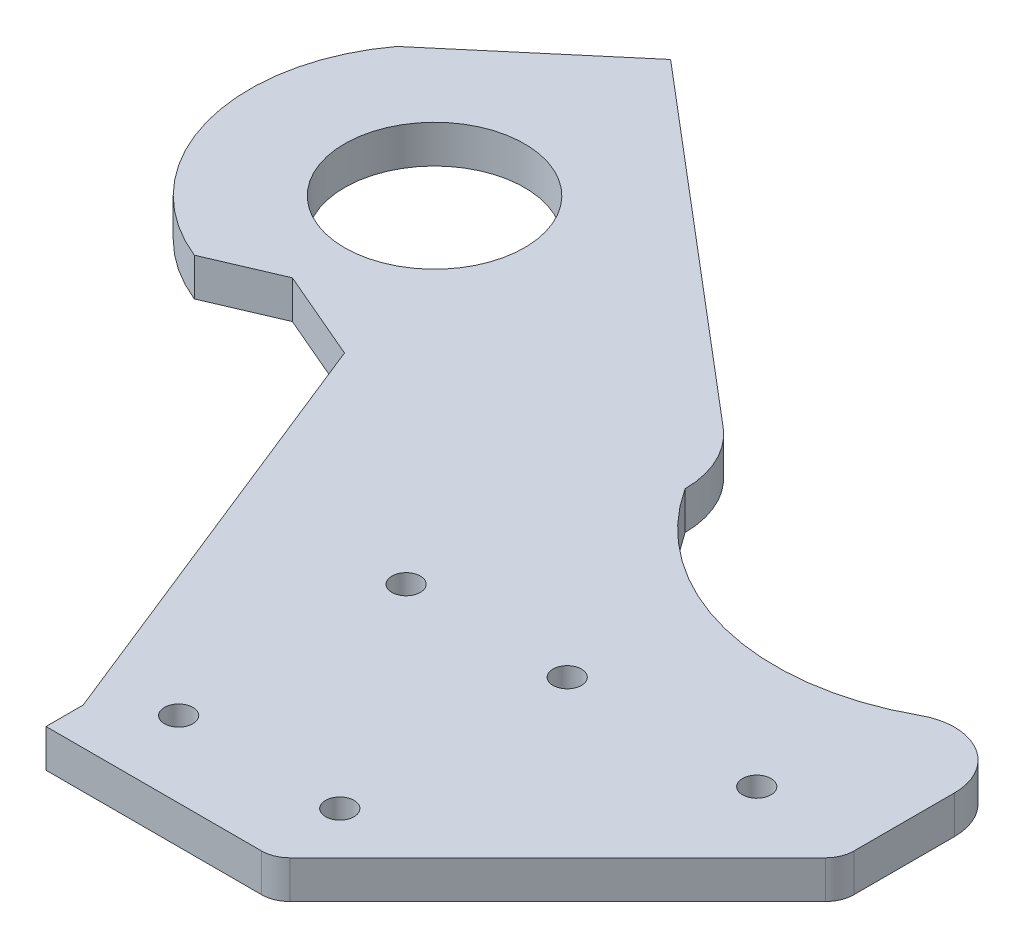
ISO-10303-21;
HEADER;
FILE_DESCRIPTION(('STEP AP214'),'2;1');
FILE_NAME('part.step','',(''),(''),'','','');
FILE_SCHEMA(('AUTOMOTIVE_DESIGN { 1 0 10303 214 1 1 1 1 }'));
ENDSEC;
DATA;
#1=APPLICATION_CONTEXT('core data for automotive mechanical design processes');
#2=APPLICATION_PROTOCOL_DEFINITION('international standard','automotive_design',2000,#1);
#3=PRODUCT_CONTEXT('',#1,'mechanical');
#4=PRODUCT('Part','Part','',(#3));
#5=PRODUCT_RELATED_PRODUCT_CATEGORY('part','',(#4));
#6=PRODUCT_DEFINITION_FORMATION('','',#4);
#7=PRODUCT_DEFINITION_CONTEXT('part definition',#1,'design');
#8=PRODUCT_DEFINITION('design','',#6,#7);
#9=PRODUCT_DEFINITION_SHAPE('','',#8);
#10=(LENGTH_UNIT() NAMED_UNIT(*) SI_UNIT(.MILLI.,.METRE.));
#11=(NAMED_UNIT(*) PLANE_ANGLE_UNIT() SI_UNIT($,.RADIAN.));
#12=(NAMED_UNIT(*) SI_UNIT($,.STERADIAN.) SOLID_ANGLE_UNIT());
#13=UNCERTAINTY_MEASURE_WITH_UNIT(LENGTH_MEASURE(1.E-05),#10,'distance_accuracy_value','');
#14=(GEOMETRIC_REPRESENTATION_CONTEXT(3) GLOBAL_UNCERTAINTY_ASSIGNED_CONTEXT((#13)) GLOBAL_UNIT_ASSIGNED_CONTEXT((#10,
#11,#12)) REPRESENTATION_CONTEXT('',''));
#15=CARTESIAN_POINT('',(0.,0.,0.));
#16=DIRECTION('',(0.,0.,1.));
#17=DIRECTION('',(1.,0.,0.));
#18=AXIS2_PLACEMENT_3D('',#15,#16,#17);
#19=CARTESIAN_POINT('',(0.,4.,0.));
#20=DIRECTION('',(0.,-1.,0.));
#21=DIRECTION('',(0.,0.,-1.));
#22=AXIS2_PLACEMENT_3D('',#19,#20,#21);
#23=PLANE('',#22);
#24=CARTESIAN_POINT('',(74.,4.,-32.));
#25=DIRECTION('',(0.,1.,0.));
#26=DIRECTION('',(0.,0.,-1.));
#27=AXIS2_PLACEMENT_3D('',#24,#25,#26);
#28=CIRCLE('',#27,1.50000000000001);
#29=CARTESIAN_POINT('',(74.,4.,-33.5));
#30=VERTEX_POINT('',#29);
#31=EDGE_CURVE('E260',#30,#30,#28,.T.);
#32=ORIENTED_EDGE('',*,*,#31,.F.);
#33=EDGE_LOOP('',(#32));
#34=FACE_BOUND('',#33,.T.);
#35=CARTESIAN_POINT('',(40.,4.,-69.));
#36=DIRECTION('',(0.,1.,0.));
#37=DIRECTION('',(0.,0.,1.));
#38=AXIS2_PLACEMENT_3D('',#35,#36,#37);
#39=CIRCLE('',#38,9.50000000000001);
#40=CARTESIAN_POINT('',(40.,4.,-59.5));
#41=VERTEX_POINT('',#40);
#42=EDGE_CURVE('E251',#41,#41,#39,.T.);
#43=ORIENTED_EDGE('',*,*,#42,.F.);
#44=EDGE_LOOP('',(#43));
#45=FACE_BOUND('',#44,.T.);
#46=CARTESIAN_POINT('',(74.,4.,-8.));
#47=DIRECTION('',(0.,1.,0.));
#48=DIRECTION('',(0.,0.,-1.));
#49=AXIS2_PLACEMENT_3D('',#46,#47,#48);
#50=CIRCLE('',#49,1.50000000000001);
#51=CARTESIAN_POINT('',(74.,4.,-9.50000000000001));
#52=VERTEX_POINT('',#51);
#53=EDGE_CURVE('E238',#52,#52,#50,.T.);
#54=ORIENTED_EDGE('',*,*,#53,.F.);
#55=EDGE_LOOP('',(#54));
#56=FACE_BOUND('',#55,.T.);
#57=CARTESIAN_POINT('',(91.,4.,-32.));
#58=DIRECTION('',(0.,1.,0.));
#59=DIRECTION('',(0.,0.,1.));
#60=AXIS2_PLACEMENT_3D('',#57,#58,#59);
#61=CIRCLE('',#60,1.5);
#62=CARTESIAN_POINT('',(91.,4.,-30.5));
#63=VERTEX_POINT('',#62);
#64=EDGE_CURVE('E281',#63,#63,#61,.T.);
#65=ORIENTED_EDGE('',*,*,#64,.F.);
#66=EDGE_LOOP('',(#65));
#67=FACE_BOUND('',#66,.T.);
#68=CARTESIAN_POINT('',(91.,4.,-8.));
#69=DIRECTION('',(0.,1.,0.));
#70=DIRECTION('',(0.,0.,1.));
#71=AXIS2_PLACEMENT_3D('',#68,#69,#70);
#72=CIRCLE('',#71,1.5);
#73=CARTESIAN_POINT('',(91.,4.,-6.5));
#74=VERTEX_POINT('',#73);
#75=EDGE_CURVE('E293',#74,#74,#72,.T.);
#76=ORIENTED_EDGE('',*,*,#75,.F.);
#77=EDGE_LOOP('',(#76));
#78=FACE_BOUND('',#77,.T.);
#79=CARTESIAN_POINT('',(111.,4.,-32.));
#80=DIRECTION('',(0.,1.,0.));
#81=DIRECTION('',(0.,0.,1.));
#82=AXIS2_PLACEMENT_3D('',#79,#80,#81);
#83=CIRCLE('',#82,1.5);
#84=CARTESIAN_POINT('',(111.,4.,-30.5));
#85=VERTEX_POINT('',#84);
#86=EDGE_CURVE('E282',#85,#85,#83,.T.);
#87=ORIENTED_EDGE('',*,*,#86,.F.);
#88=EDGE_LOOP('',(#87));
#89=FACE_BOUND('',#88,.T.);
#90=CARTESIAN_POINT('',(101.,4.,-69.));
#91=DIRECTION('',(0.,1.,0.));
#92=DIRECTION('',(0.,0.,1.));
#93=AXIS2_PLACEMENT_3D('',#90,#91,#92);
#94=CIRCLE('',#93,25.);
#95=CARTESIAN_POINT('',(80.,4.,-55.4353400337495));
#96=VERTEX_POINT('',#95);
#97=CARTESIAN_POINT('',(113.096774193548,4.,-47.1215161834669));
#98=VERTEX_POINT('',#97);
#99=EDGE_CURVE('E160',#96,#98,#94,.T.);
#100=ORIENTED_EDGE('',*,*,#99,.F.);
#101=CARTESIAN_POINT('',(70.0002315120612,4.,-55.3672945517073));
#102=DIRECTION('',(0.,-1.,0.));
#103=DIRECTION('',(0.,0.,-1.));
#104=AXIS2_PLACEMENT_3D('',#101,#102,#103);
#105=CIRCLE('',#104,10.);
#106=CARTESIAN_POINT('',(76.4665386997027,4.,-62.9953264967805));
#107=VERTEX_POINT('',#106);
#108=EDGE_CURVE('E168',#96,#107,#105,.F.);
#109=ORIENTED_EDGE('',*,*,#108,.T.);
#110=DIRECTION('',(-0.762803194507315,0.,-0.646630718764146));
#111=VECTOR('',#110,1.);
#112=CARTESIAN_POINT('',(40.,4.,-93.9081285144222));
#113=LINE('',#112,#111);
#114=CARTESIAN_POINT('',(40.,4.,-93.9081285144222));
#115=VERTEX_POINT('',#114);
#116=EDGE_CURVE('E241',#107,#115,#113,.T.);
#117=ORIENTED_EDGE('',*,*,#116,.T.);
#118=DIRECTION('',(-0.762803194507315,0.,0.646630718764146));
#119=VECTOR('',#118,1.);
#120=CARTESIAN_POINT('',(0.,4.,-60.));
#121=LINE('',#120,#119);
#122=CARTESIAN_POINT('',(24.3672309102859,4.,-80.6561799311644));
#123=VERTEX_POINT('',#122);
#124=EDGE_CURVE('E225',#115,#123,#121,.T.);
#125=ORIENTED_EDGE('',*,*,#124,.T.);
#126=CARTESIAN_POINT('',(40.,4.,-69.));
#127=DIRECTION('',(0.,1.,0.));
#128=DIRECTION('',(0.,0.,1.));
#129=AXIS2_PLACEMENT_3D('',#126,#127,#128);
#130=CIRCLE('',#129,19.5);
#131=CARTESIAN_POINT('',(32.7560347466034,4.,-50.8954434628301));
#132=VERTEX_POINT('',#131);
#133=EDGE_CURVE('E274',#123,#132,#130,.T.);
#134=ORIENTED_EDGE('',*,*,#133,.T.);
#135=DIRECTION('',(0.919145030018058,0.,-0.393919298579168));
#136=VECTOR('',#135,1.);
#137=CARTESIAN_POINT('',(12.,4.,-42.));
#138=LINE('',#137,#136);
#139=CARTESIAN_POINT('',(40.,4.,-54.));
#140=VERTEX_POINT('',#139);
#141=EDGE_CURVE('E228',#132,#140,#138,.T.);
#142=ORIENTED_EDGE('',*,*,#141,.T.);
#143=DIRECTION('',(0.919145030018058,0.,0.393919298579168));
#144=VECTOR('',#143,1.);
#145=CARTESIAN_POINT('',(40.,4.,-54.));
#146=LINE('',#145,#144);
#147=CARTESIAN_POINT('',(49.6170993996389,4.,-49.8783859715833));
#148=VERTEX_POINT('',#147);
#149=EDGE_CURVE('E247',#140,#148,#146,.T.);
#150=ORIENTED_EDGE('',*,*,#149,.T.);
#151=DIRECTION('',(-0.371390676354099,0.,-0.928476690885261));
#152=VECTOR('',#151,1.);
#153=CARTESIAN_POINT('',(59.9728049898899,4.,-23.9891219959556));
#154=LINE('',#153,#152);
#155=CARTESIAN_POINT('',(68.,4.,-3.92113447067986));
#156=VERTEX_POINT('',#155);
#157=EDGE_CURVE('E11',#148,#156,#154,.F.);
#158=ORIENTED_EDGE('',*,*,#157,.T.);
#159=DIRECTION('',(0.,0.,1.));
#160=VECTOR('',#159,1.);
#161=CARTESIAN_POINT('',(68.,4.,0.));
#162=LINE('',#161,#160);
#163=CARTESIAN_POINT('',(68.,4.,0.));
#164=VERTEX_POINT('',#163);
#165=EDGE_CURVE('E246',#156,#164,#162,.T.);
#166=ORIENTED_EDGE('',*,*,#165,.T.);
#167=DIRECTION('',(1.,0.,0.));
#168=VECTOR('',#167,1.);
#169=CARTESIAN_POINT('',(80.,4.,0.));
#170=LINE('',#169,#168);
#171=CARTESIAN_POINT('',(90.7573593128813,4.,0.));
#172=VERTEX_POINT('',#171);
#173=EDGE_CURVE('E243',#164,#172,#170,.T.);
#174=ORIENTED_EDGE('',*,*,#173,.T.);
#175=CARTESIAN_POINT('',(90.7573593128813,4.,-3.00000000000001));
#176=DIRECTION('',(0.,-1.,0.));
#177=DIRECTION('',(0.,0.,-1.));
#178=AXIS2_PLACEMENT_3D('',#175,#176,#177);
#179=CIRCLE('',#178,3.);
#180=CARTESIAN_POINT('',(92.878679656441,4.,-0.878679656440395));
#181=VERTEX_POINT('',#180);
#182=EDGE_CURVE('E207',#172,#181,#179,.F.);
#183=ORIENTED_EDGE('',*,*,#182,.T.);
#184=DIRECTION('',(-0.707106781186541,0.,0.707106781186554));
#185=VECTOR('',#184,1.);
#186=CARTESIAN_POINT('',(122.,4.,-30.));
#187=LINE('',#186,#185);
#188=CARTESIAN_POINT('',(121.12132034356,4.,-29.1213203435597));
#189=VERTEX_POINT('',#188);
#190=EDGE_CURVE('E297',#189,#181,#187,.T.);
#191=ORIENTED_EDGE('',*,*,#190,.F.);
#192=CARTESIAN_POINT('',(119.,4.,-31.2426406871193));
#193=DIRECTION('',(0.,-1.,0.));
#194=DIRECTION('',(0.,0.,-1.));
#195=AXIS2_PLACEMENT_3D('',#192,#193,#194);
#196=CIRCLE('',#195,3.);
#197=CARTESIAN_POINT('',(122.,4.,-31.2426406871193));
#198=VERTEX_POINT('',#197);
#199=EDGE_CURVE('E203',#189,#198,#196,.F.);
#200=ORIENTED_EDGE('',*,*,#199,.T.);
#201=DIRECTION('',(0.,0.,1.));
#202=VECTOR('',#201,1.);
#203=CARTESIAN_POINT('',(122.,4.,0.));
#204=LINE('',#203,#202);
#205=CARTESIAN_POINT('',(122.,4.,-41.8706800674989));
#206=VERTEX_POINT('',#205);
#207=EDGE_CURVE('E167',#206,#198,#204,.T.);
#208=ORIENTED_EDGE('',*,*,#207,.F.);
#209=CARTESIAN_POINT('',(116.,4.,-41.8706800674989));
#210=DIRECTION('',(0.,-1.,0.));
#211=DIRECTION('',(0.,0.,-1.));
#212=AXIS2_PLACEMENT_3D('',#209,#210,#211);
#213=CIRCLE('',#212,6.);
#214=EDGE_CURVE('E169',#206,#98,#213,.F.);
#215=ORIENTED_EDGE('',*,*,#214,.T.);
#216=EDGE_LOOP('',(#100,#109,#117,#125,#134,#142,#150,#158,#166,#174,#183,#191,#200,#208,#215));
#217=FACE_BOUND('',#216,.T.);
#218=ADVANCED_FACE('F44',(#34,#45,#56,#67,#78,#89,#217),#23,.F.);
#219=CARTESIAN_POINT('',(0.,0.,0.));
#220=DIRECTION('',(0.,-1.,0.));
#221=DIRECTION('',(0.,0.,-1.));
#222=AXIS2_PLACEMENT_3D('',#219,#220,#221);
#223=PLANE('',#222);
#224=CARTESIAN_POINT('',(74.,0.,-32.));
#225=DIRECTION('',(0.,1.,0.));
#226=DIRECTION('',(0.,0.,-1.));
#227=AXIS2_PLACEMENT_3D('',#224,#225,#226);
#228=CIRCLE('',#227,1.50000000000001);
#229=CARTESIAN_POINT('',(74.,0.,-33.5));
#230=VERTEX_POINT('',#229);
#231=EDGE_CURVE('E265',#230,#230,#228,.T.);
#232=ORIENTED_EDGE('',*,*,#231,.T.);
#233=EDGE_LOOP('',(#232));
#234=FACE_BOUND('',#233,.T.);
#235=CARTESIAN_POINT('',(74.,0.,-8.));
#236=DIRECTION('',(0.,1.,0.));
#237=DIRECTION('',(0.,0.,-1.));
#238=AXIS2_PLACEMENT_3D('',#235,#236,#237);
#239=CIRCLE('',#238,1.50000000000001);
#240=CARTESIAN_POINT('',(74.,0.,-9.50000000000001));
#241=VERTEX_POINT('',#240);
#242=EDGE_CURVE('E252',#241,#241,#239,.T.);
#243=ORIENTED_EDGE('',*,*,#242,.T.);
#244=EDGE_LOOP('',(#243));
#245=FACE_BOUND('',#244,.T.);
#246=CARTESIAN_POINT('',(40.,0.,-69.));
#247=DIRECTION('',(0.,1.,0.));
#248=DIRECTION('',(0.,0.,1.));
#249=AXIS2_PLACEMENT_3D('',#246,#247,#248);
#250=CIRCLE('',#249,9.50000000000001);
#251=CARTESIAN_POINT('',(40.,0.,-59.5));
#252=VERTEX_POINT('',#251);
#253=EDGE_CURVE('E257',#252,#252,#250,.T.);
#254=ORIENTED_EDGE('',*,*,#253,.T.);
#255=EDGE_LOOP('',(#254));
#256=FACE_BOUND('',#255,.T.);
#257=CARTESIAN_POINT('',(91.,0.,-32.));
#258=DIRECTION('',(0.,1.,0.));
#259=DIRECTION('',(0.,0.,1.));
#260=AXIS2_PLACEMENT_3D('',#257,#258,#259);
#261=CIRCLE('',#260,1.5);
#262=CARTESIAN_POINT('',(91.,0.,-30.5));
#263=VERTEX_POINT('',#262);
#264=EDGE_CURVE('E161',#263,#263,#261,.T.);
#265=ORIENTED_EDGE('',*,*,#264,.T.);
#266=EDGE_LOOP('',(#265));
#267=FACE_BOUND('',#266,.T.);
#268=CARTESIAN_POINT('',(91.,0.,-8.));
#269=DIRECTION('',(0.,1.,0.));
#270=DIRECTION('',(0.,0.,1.));
#271=AXIS2_PLACEMENT_3D('',#268,#269,#270);
#272=CIRCLE('',#271,1.5);
#273=CARTESIAN_POINT('',(91.,0.,-6.5));
#274=VERTEX_POINT('',#273);
#275=EDGE_CURVE('E295',#274,#274,#272,.T.);
#276=ORIENTED_EDGE('',*,*,#275,.T.);
#277=EDGE_LOOP('',(#276));
#278=FACE_BOUND('',#277,.T.);
#279=CARTESIAN_POINT('',(111.,0.,-32.));
#280=DIRECTION('',(0.,1.,0.));
#281=DIRECTION('',(0.,0.,1.));
#282=AXIS2_PLACEMENT_3D('',#279,#280,#281);
#283=CIRCLE('',#282,1.5);
#284=CARTESIAN_POINT('',(111.,0.,-30.5));
#285=VERTEX_POINT('',#284);
#286=EDGE_CURVE('E288',#285,#285,#283,.T.);
#287=ORIENTED_EDGE('',*,*,#286,.T.);
#288=EDGE_LOOP('',(#287));
#289=FACE_BOUND('',#288,.T.);
#290=DIRECTION('',(-0.762803194507315,0.,-0.646630718764146));
#291=VECTOR('',#290,1.);
#292=CARTESIAN_POINT('',(40.,0.,-93.9081285144222));
#293=LINE('',#292,#291);
#294=CARTESIAN_POINT('',(76.4665386997027,0.,-62.9953264967805));
#295=VERTEX_POINT('',#294);
#296=CARTESIAN_POINT('',(40.,0.,-93.9081285144222));
#297=VERTEX_POINT('',#296);
#298=EDGE_CURVE('E227',#295,#297,#293,.T.);
#299=ORIENTED_EDGE('',*,*,#298,.F.);
#300=CARTESIAN_POINT('',(70.0002315120612,0.,-55.3672945517073));
#301=DIRECTION('',(0.,-1.,0.));
#302=DIRECTION('',(0.,0.,-1.));
#303=AXIS2_PLACEMENT_3D('',#300,#301,#302);
#304=CIRCLE('',#303,10.);
#305=CARTESIAN_POINT('',(80.,0.,-55.4353400337495));
#306=VERTEX_POINT('',#305);
#307=EDGE_CURVE('E180',#295,#306,#304,.T.);
#308=ORIENTED_EDGE('',*,*,#307,.T.);
#309=CARTESIAN_POINT('',(101.,0.,-69.));
#310=DIRECTION('',(0.,-1.,0.));
#311=DIRECTION('',(0.,0.,-1.));
#312=AXIS2_PLACEMENT_3D('',#309,#310,#311);
#313=CIRCLE('',#312,25.);
#314=CARTESIAN_POINT('',(113.096774193548,0.,-47.1215161834669));
#315=VERTEX_POINT('',#314);
#316=EDGE_CURVE('E156',#306,#315,#313,.F.);
#317=ORIENTED_EDGE('',*,*,#316,.T.);
#318=CARTESIAN_POINT('',(116.,0.,-41.8706800674989));
#319=DIRECTION('',(0.,-1.,0.));
#320=DIRECTION('',(0.,0.,-1.));
#321=AXIS2_PLACEMENT_3D('',#318,#319,#320);
#322=CIRCLE('',#321,6.);
#323=CARTESIAN_POINT('',(122.,0.,-41.8706800674989));
#324=VERTEX_POINT('',#323);
#325=EDGE_CURVE('E184',#315,#324,#322,.T.);
#326=ORIENTED_EDGE('',*,*,#325,.T.);
#327=DIRECTION('',(0.,0.,1.));
#328=VECTOR('',#327,1.);
#329=CARTESIAN_POINT('',(122.,0.,0.));
#330=LINE('',#329,#328);
#331=CARTESIAN_POINT('',(122.,0.,-31.2426406871193));
#332=VERTEX_POINT('',#331);
#333=EDGE_CURVE('E277',#324,#332,#330,.T.);
#334=ORIENTED_EDGE('',*,*,#333,.T.);
#335=CARTESIAN_POINT('',(119.,0.,-31.2426406871193));
#336=DIRECTION('',(0.,-1.,0.));
#337=DIRECTION('',(0.,0.,-1.));
#338=AXIS2_PLACEMENT_3D('',#335,#336,#337);
#339=CIRCLE('',#338,3.);
#340=CARTESIAN_POINT('',(121.12132034356,0.,-29.1213203435597));
#341=VERTEX_POINT('',#340);
#342=EDGE_CURVE('E199',#332,#341,#339,.T.);
#343=ORIENTED_EDGE('',*,*,#342,.T.);
#344=DIRECTION('',(-0.707106781186541,0.,0.707106781186554));
#345=VECTOR('',#344,1.);
#346=CARTESIAN_POINT('',(122.,0.,-30.));
#347=LINE('',#346,#345);
#348=CARTESIAN_POINT('',(92.878679656441,0.,-0.878679656440395));
#349=VERTEX_POINT('',#348);
#350=EDGE_CURVE('E300',#341,#349,#347,.T.);
#351=ORIENTED_EDGE('',*,*,#350,.T.);
#352=CARTESIAN_POINT('',(90.7573593128813,0.,-3.00000000000001));
#353=DIRECTION('',(0.,-1.,0.));
#354=DIRECTION('',(0.,0.,-1.));
#355=AXIS2_PLACEMENT_3D('',#352,#353,#354);
#356=CIRCLE('',#355,3.);
#357=CARTESIAN_POINT('',(90.7573593128813,0.,0.));
#358=VERTEX_POINT('',#357);
#359=EDGE_CURVE('E200',#349,#358,#356,.T.);
#360=ORIENTED_EDGE('',*,*,#359,.T.);
#361=DIRECTION('',(1.,0.,0.));
#362=VECTOR('',#361,1.);
#363=CARTESIAN_POINT('',(80.,0.,0.));
#364=LINE('',#363,#362);
#365=CARTESIAN_POINT('',(68.,0.,0.));
#366=VERTEX_POINT('',#365);
#367=EDGE_CURVE('E230',#366,#358,#364,.T.);
#368=ORIENTED_EDGE('',*,*,#367,.F.);
#369=DIRECTION('',(0.,0.,1.));
#370=VECTOR('',#369,1.);
#371=CARTESIAN_POINT('',(68.,0.,0.));
#372=LINE('',#371,#370);
#373=CARTESIAN_POINT('',(68.,0.,-3.92113447067986));
#374=VERTEX_POINT('',#373);
#375=EDGE_CURVE('E235',#374,#366,#372,.T.);
#376=ORIENTED_EDGE('',*,*,#375,.F.);
#377=DIRECTION('',(0.371390676354099,0.,0.928476690885261));
#378=VECTOR('',#377,1.);
#379=CARTESIAN_POINT('',(68.,0.,-3.92113447067986));
#380=LINE('',#379,#378);
#381=CARTESIAN_POINT('',(49.6170993996389,0.,-49.8783859715833));
#382=VERTEX_POINT('',#381);
#383=EDGE_CURVE('E53',#374,#382,#380,.F.);
#384=ORIENTED_EDGE('',*,*,#383,.T.);
#385=DIRECTION('',(0.919145030018058,0.,0.393919298579168));
#386=VECTOR('',#385,1.);
#387=CARTESIAN_POINT('',(40.,0.,-54.));
#388=LINE('',#387,#386);
#389=CARTESIAN_POINT('',(40.,0.,-54.));
#390=VERTEX_POINT('',#389);
#391=EDGE_CURVE('E234',#390,#382,#388,.T.);
#392=ORIENTED_EDGE('',*,*,#391,.F.);
#393=DIRECTION('',(0.919145030018058,0.,-0.393919298579168));
#394=VECTOR('',#393,1.);
#395=CARTESIAN_POINT('',(12.,0.,-42.));
#396=LINE('',#395,#394);
#397=CARTESIAN_POINT('',(32.7560347466034,0.,-50.8954434628301));
#398=VERTEX_POINT('',#397);
#399=EDGE_CURVE('E236',#398,#390,#396,.T.);
#400=ORIENTED_EDGE('',*,*,#399,.F.);
#401=CARTESIAN_POINT('',(40.,0.,-69.));
#402=DIRECTION('',(0.,1.,0.));
#403=DIRECTION('',(0.,0.,1.));
#404=AXIS2_PLACEMENT_3D('',#401,#402,#403);
#405=CIRCLE('',#404,19.5);
#406=CARTESIAN_POINT('',(24.3672309102859,0.,-80.6561799311644));
#407=VERTEX_POINT('',#406);
#408=EDGE_CURVE('E275',#407,#398,#405,.T.);
#409=ORIENTED_EDGE('',*,*,#408,.F.);
#410=DIRECTION('',(-0.762803194507315,0.,0.646630718764146));
#411=VECTOR('',#410,1.);
#412=CARTESIAN_POINT('',(0.,0.,-60.));
#413=LINE('',#412,#411);
#414=EDGE_CURVE('E223',#297,#407,#413,.T.);
#415=ORIENTED_EDGE('',*,*,#414,.F.);
#416=EDGE_LOOP('',(#299,#308,#317,#326,#334,#343,#351,#360,#368,#376,#384,#392,#400,#409,#415));
#417=FACE_BOUND('',#416,.T.);
#418=ADVANCED_FACE('F310',(#234,#245,#256,#267,#278,#289,#417),#223,.T.);
#419=CARTESIAN_POINT('',(122.,-69.5490972238852,0.));
#420=DIRECTION('',(-1.,0.,0.));
#421=DIRECTION('',(0.,0.,1.));
#422=AXIS2_PLACEMENT_3D('',#419,#420,#421);
#423=PLANE('',#422);
#424=ORIENTED_EDGE('',*,*,#333,.F.);
#425=DIRECTION('',(0.,1.,0.));
#426=VECTOR('',#425,1.);
#427=CARTESIAN_POINT('',(122.,-69.5490972238852,-41.8706800674989));
#428=LINE('',#427,#426);
#429=EDGE_CURVE('E188',#324,#206,#428,.T.);
#430=ORIENTED_EDGE('',*,*,#429,.T.);
#431=ORIENTED_EDGE('',*,*,#207,.T.);
#432=DIRECTION('',(0.,1.,0.));
#433=VECTOR('',#432,1.);
#434=CARTESIAN_POINT('',(122.,-69.5490972238852,-31.2426406871193));
#435=LINE('',#434,#433);
#436=EDGE_CURVE('E197',#198,#332,#435,.F.);
#437=ORIENTED_EDGE('',*,*,#436,.T.);
#438=EDGE_LOOP('',(#424,#430,#431,#437));
#439=FACE_BOUND('',#438,.T.);
#440=ADVANCED_FACE('F339',(#439),#423,.F.);
#441=CARTESIAN_POINT('',(12.,4.,-42.));
#442=DIRECTION('',(-0.393919298579168,0.,-0.919145030018058));
#443=DIRECTION('',(-0.919145030018058,0.,0.393919298579168));
#444=AXIS2_PLACEMENT_3D('',#441,#442,#443);
#445=PLANE('',#444);
#446=DIRECTION('',(0.,1.,0.));
#447=VECTOR('',#446,1.);
#448=CARTESIAN_POINT('',(32.7560347466034,0.,-50.8954434628301));
#449=LINE('',#448,#447);
#450=EDGE_CURVE('E267',#398,#132,#449,.T.);
#451=ORIENTED_EDGE('',*,*,#450,.F.);
#452=ORIENTED_EDGE('',*,*,#399,.T.);
#453=DIRECTION('',(0.,-1.,0.));
#454=VECTOR('',#453,1.);
#455=CARTESIAN_POINT('',(40.,4.,-54.));
#456=LINE('',#455,#454);
#457=EDGE_CURVE('E214',#140,#390,#456,.T.);
#458=ORIENTED_EDGE('',*,*,#457,.F.);
#459=ORIENTED_EDGE('',*,*,#141,.F.);
#460=EDGE_LOOP('',(#451,#452,#458,#459));
#461=FACE_BOUND('',#460,.T.);
#462=ADVANCED_FACE('F365',(#461),#445,.F.);
#463=CARTESIAN_POINT('',(40.,4.,-54.));
#464=DIRECTION('',(0.393919298579168,0.,-0.919145030018058));
#465=DIRECTION('',(-0.919145030018058,0.,-0.393919298579168));
#466=AXIS2_PLACEMENT_3D('',#463,#464,#465);
#467=PLANE('',#466);
#468=ORIENTED_EDGE('',*,*,#391,.T.);
#469=DIRECTION('',(0.,1.,0.));
#470=VECTOR('',#469,1.);
#471=CARTESIAN_POINT('',(49.6170993996389,4.,-49.8783859715833));
#472=LINE('',#471,#470);
#473=EDGE_CURVE('E61',#382,#148,#472,.T.);
#474=ORIENTED_EDGE('',*,*,#473,.T.);
#475=ORIENTED_EDGE('',*,*,#149,.F.);
#476=ORIENTED_EDGE('',*,*,#457,.T.);
#477=EDGE_LOOP('',(#468,#474,#475,#476));
#478=FACE_BOUND('',#477,.T.);
#479=ADVANCED_FACE('F360',(#478),#467,.F.);
#480=CARTESIAN_POINT('',(68.,4.,0.));
#481=DIRECTION('',(1.,0.,0.));
#482=DIRECTION('',(0.,0.,-1.));
#483=AXIS2_PLACEMENT_3D('',#480,#481,#482);
#484=PLANE('',#483);
#485=ORIENTED_EDGE('',*,*,#165,.F.);
#486=DIRECTION('',(0.,-1.,0.));
#487=VECTOR('',#486,1.);
#488=CARTESIAN_POINT('',(68.,0.,-3.92113447067986));
#489=LINE('',#488,#487);
#490=EDGE_CURVE('E176',#156,#374,#489,.T.);
#491=ORIENTED_EDGE('',*,*,#490,.T.);
#492=ORIENTED_EDGE('',*,*,#375,.T.);
#493=DIRECTION('',(0.,-1.,0.));
#494=VECTOR('',#493,1.);
#495=CARTESIAN_POINT('',(68.,4.,0.));
#496=LINE('',#495,#494);
#497=EDGE_CURVE('E219',#164,#366,#496,.T.);
#498=ORIENTED_EDGE('',*,*,#497,.F.);
#499=EDGE_LOOP('',(#485,#491,#492,#498));
#500=FACE_BOUND('',#499,.T.);
#501=ADVANCED_FACE('F325',(#500),#484,.F.);
#502=CARTESIAN_POINT('',(80.,4.,0.));
#503=DIRECTION('',(0.,0.,-1.));
#504=DIRECTION('',(-1.,0.,0.));
#505=AXIS2_PLACEMENT_3D('',#502,#503,#504);
#506=PLANE('',#505);
#507=ORIENTED_EDGE('',*,*,#367,.T.);
#508=DIRECTION('',(0.,1.,0.));
#509=VECTOR('',#508,1.);
#510=CARTESIAN_POINT('',(90.7573593128813,4.,0.));
#511=LINE('',#510,#509);
#512=EDGE_CURVE('E194',#358,#172,#511,.T.);
#513=ORIENTED_EDGE('',*,*,#512,.T.);
#514=ORIENTED_EDGE('',*,*,#173,.F.);
#515=ORIENTED_EDGE('',*,*,#497,.T.);
#516=EDGE_LOOP('',(#507,#513,#514,#515));
#517=FACE_BOUND('',#516,.T.);
#518=ADVANCED_FACE('F319',(#517),#506,.F.);
#519=CARTESIAN_POINT('',(40.,4.,-93.9081285144222));
#520=DIRECTION('',(-0.646630718764146,0.,0.762803194507315));
#521=DIRECTION('',(0.762803194507315,0.,0.646630718764146));
#522=AXIS2_PLACEMENT_3D('',#519,#520,#521);
#523=PLANE('',#522);
#524=ORIENTED_EDGE('',*,*,#116,.F.);
#525=DIRECTION('',(0.,1.,0.));
#526=VECTOR('',#525,1.);
#527=CARTESIAN_POINT('',(76.4665386997027,4.,-62.9953264967805));
#528=LINE('',#527,#526);
#529=EDGE_CURVE('E174',#107,#295,#528,.F.);
#530=ORIENTED_EDGE('',*,*,#529,.T.);
#531=ORIENTED_EDGE('',*,*,#298,.T.);
#532=DIRECTION('',(0.,-1.,0.));
#533=VECTOR('',#532,1.);
#534=CARTESIAN_POINT('',(40.,4.,-93.9081285144222));
#535=LINE('',#534,#533);
#536=EDGE_CURVE('E218',#115,#297,#535,.T.);
#537=ORIENTED_EDGE('',*,*,#536,.F.);
#538=EDGE_LOOP('',(#524,#530,#531,#537));
#539=FACE_BOUND('',#538,.T.);
#540=ADVANCED_FACE('F352',(#539),#523,.F.);
#541=CARTESIAN_POINT('',(0.,4.,-60.));
#542=DIRECTION('',(0.646630718764146,0.,0.762803194507315));
#543=DIRECTION('',(0.762803194507315,0.,-0.646630718764146));
#544=AXIS2_PLACEMENT_3D('',#541,#542,#543);
#545=PLANE('',#544);
#546=ORIENTED_EDGE('',*,*,#414,.T.);
#547=DIRECTION('',(0.,1.,0.));
#548=VECTOR('',#547,1.);
#549=CARTESIAN_POINT('',(24.3672309102859,0.,-80.6561799311644));
#550=LINE('',#549,#548);
#551=EDGE_CURVE('E269',#407,#123,#550,.T.);
#552=ORIENTED_EDGE('',*,*,#551,.T.);
#553=ORIENTED_EDGE('',*,*,#124,.F.);
#554=ORIENTED_EDGE('',*,*,#536,.T.);
#555=EDGE_LOOP('',(#546,#552,#553,#554));
#556=FACE_BOUND('',#555,.T.);
#557=ADVANCED_FACE('F350',(#556),#545,.F.);
#558=CARTESIAN_POINT('',(74.,4.,-8.));
#559=DIRECTION('',(0.,-1.,0.));
#560=DIRECTION('',(0.,0.,-1.));
#561=AXIS2_PLACEMENT_3D('',#558,#559,#560);
#562=CYLINDRICAL_SURFACE('',#561,1.50000000000001);
#563=ORIENTED_EDGE('',*,*,#53,.T.);
#564=EDGE_LOOP('',(#563));
#565=FACE_BOUND('',#564,.T.);
#566=ORIENTED_EDGE('',*,*,#242,.F.);
#567=EDGE_LOOP('',(#566));
#568=FACE_BOUND('',#567,.T.);
#569=ADVANCED_FACE('F345',(#565,#568),#562,.F.);
#570=CARTESIAN_POINT('',(40.,4.,-69.));
#571=DIRECTION('',(0.,-1.,0.));
#572=DIRECTION('',(0.,0.,-1.));
#573=AXIS2_PLACEMENT_3D('',#570,#571,#572);
#574=CYLINDRICAL_SURFACE('',#573,9.50000000000001);
#575=ORIENTED_EDGE('',*,*,#42,.T.);
#576=EDGE_LOOP('',(#575));
#577=FACE_BOUND('',#576,.T.);
#578=ORIENTED_EDGE('',*,*,#253,.F.);
#579=EDGE_LOOP('',(#578));
#580=FACE_BOUND('',#579,.T.);
#581=ADVANCED_FACE('F408',(#577,#580),#574,.F.);
#582=CARTESIAN_POINT('',(74.,4.,-32.));
#583=DIRECTION('',(0.,-1.,0.));
#584=DIRECTION('',(0.,0.,-1.));
#585=AXIS2_PLACEMENT_3D('',#582,#583,#584);
#586=CYLINDRICAL_SURFACE('',#585,1.50000000000001);
#587=ORIENTED_EDGE('',*,*,#31,.T.);
#588=EDGE_LOOP('',(#587));
#589=FACE_BOUND('',#588,.T.);
#590=ORIENTED_EDGE('',*,*,#231,.F.);
#591=EDGE_LOOP('',(#590));
#592=FACE_BOUND('',#591,.T.);
#593=ADVANCED_FACE('F406',(#589,#592),#586,.F.);
#594=CARTESIAN_POINT('',(40.,0.,-69.));
#595=DIRECTION('',(0.,1.,0.));
#596=DIRECTION('',(0.,0.,1.));
#597=AXIS2_PLACEMENT_3D('',#594,#595,#596);
#598=CYLINDRICAL_SURFACE('',#597,19.5);
#599=ORIENTED_EDGE('',*,*,#133,.F.);
#600=ORIENTED_EDGE('',*,*,#551,.F.);
#601=ORIENTED_EDGE('',*,*,#408,.T.);
#602=ORIENTED_EDGE('',*,*,#450,.T.);
#603=EDGE_LOOP('',(#599,#600,#601,#602));
#604=FACE_BOUND('',#603,.T.);
#605=ADVANCED_FACE('F401',(#604),#598,.T.);
#606=CARTESIAN_POINT('',(101.,-69.5490972238852,-69.));
#607=DIRECTION('',(0.,1.,0.));
#608=DIRECTION('',(0.,0.,1.));
#609=AXIS2_PLACEMENT_3D('',#606,#607,#608);
#610=CYLINDRICAL_SURFACE('',#609,25.);
#611=ORIENTED_EDGE('',*,*,#99,.T.);
#612=DIRECTION('',(0.,1.,0.));
#613=VECTOR('',#612,1.);
#614=CARTESIAN_POINT('',(113.096774193548,-69.5490972238852,-47.1215161834669));
#615=LINE('',#614,#613);
#616=EDGE_CURVE('E190',#98,#315,#615,.F.);
#617=ORIENTED_EDGE('',*,*,#616,.T.);
#618=ORIENTED_EDGE('',*,*,#316,.F.);
#619=DIRECTION('',(0.,1.,0.));
#620=VECTOR('',#619,1.);
#621=CARTESIAN_POINT('',(80.,-69.5490972238852,-55.4353400337495));
#622=LINE('',#621,#620);
#623=EDGE_CURVE('E153',#306,#96,#622,.T.);
#624=ORIENTED_EDGE('',*,*,#623,.T.);
#625=EDGE_LOOP('',(#611,#617,#618,#624));
#626=FACE_BOUND('',#625,.T.);
#627=ADVANCED_FACE('F157',(#626),#610,.F.);
#628=CARTESIAN_POINT('',(91.,0.,-32.));
#629=DIRECTION('',(0.,1.,0.));
#630=DIRECTION('',(0.,0.,1.));
#631=AXIS2_PLACEMENT_3D('',#628,#629,#630);
#632=CYLINDRICAL_SURFACE('',#631,1.5);
#633=ORIENTED_EDGE('',*,*,#264,.F.);
#634=EDGE_LOOP('',(#633));
#635=FACE_BOUND('',#634,.T.);
#636=ORIENTED_EDGE('',*,*,#64,.T.);
#637=EDGE_LOOP('',(#636));
#638=FACE_BOUND('',#637,.T.);
#639=ADVANCED_FACE('F393',(#635,#638),#632,.F.);
#640=CARTESIAN_POINT('',(91.,0.,-8.));
#641=DIRECTION('',(0.,1.,0.));
#642=DIRECTION('',(0.,0.,1.));
#643=AXIS2_PLACEMENT_3D('',#640,#641,#642);
#644=CYLINDRICAL_SURFACE('',#643,1.5);
#645=ORIENTED_EDGE('',*,*,#275,.F.);
#646=EDGE_LOOP('',(#645));
#647=FACE_BOUND('',#646,.T.);
#648=ORIENTED_EDGE('',*,*,#75,.T.);
#649=EDGE_LOOP('',(#648));
#650=FACE_BOUND('',#649,.T.);
#651=ADVANCED_FACE('F388',(#647,#650),#644,.F.);
#652=CARTESIAN_POINT('',(111.,0.,-32.));
#653=DIRECTION('',(0.,1.,0.));
#654=DIRECTION('',(0.,0.,1.));
#655=AXIS2_PLACEMENT_3D('',#652,#653,#654);
#656=CYLINDRICAL_SURFACE('',#655,1.5);
#657=ORIENTED_EDGE('',*,*,#286,.F.);
#658=EDGE_LOOP('',(#657));
#659=FACE_BOUND('',#658,.T.);
#660=ORIENTED_EDGE('',*,*,#86,.T.);
#661=EDGE_LOOP('',(#660));
#662=FACE_BOUND('',#661,.T.);
#663=ADVANCED_FACE('F381',(#659,#662),#656,.F.);
#664=CARTESIAN_POINT('',(122.,0.,-30.));
#665=DIRECTION('',(-0.707106781186554,0.,-0.707106781186541));
#666=DIRECTION('',(-0.707106781186541,0.,0.707106781186554));
#667=AXIS2_PLACEMENT_3D('',#664,#665,#666);
#668=PLANE('',#667);
#669=ORIENTED_EDGE('',*,*,#350,.F.);
#670=DIRECTION('',(0.,1.,0.));
#671=VECTOR('',#670,1.);
#672=CARTESIAN_POINT('',(121.12132034356,0.,-29.1213203435597));
#673=LINE('',#672,#671);
#674=EDGE_CURVE('E206',#341,#189,#673,.T.);
#675=ORIENTED_EDGE('',*,*,#674,.T.);
#676=ORIENTED_EDGE('',*,*,#190,.T.);
#677=DIRECTION('',(0.,1.,0.));
#678=VECTOR('',#677,1.);
#679=CARTESIAN_POINT('',(92.878679656441,0.,-0.878679656440385));
#680=LINE('',#679,#678);
#681=EDGE_CURVE('E211',#181,#349,#680,.F.);
#682=ORIENTED_EDGE('',*,*,#681,.T.);
#683=EDGE_LOOP('',(#669,#675,#676,#682));
#684=FACE_BOUND('',#683,.T.);
#685=ADVANCED_FACE('F367',(#684),#668,.F.);
#686=CARTESIAN_POINT('',(119.,0.,-31.2426406871193));
#687=DIRECTION('',(0.,1.,0.));
#688=DIRECTION('',(0.,0.,1.));
#689=AXIS2_PLACEMENT_3D('',#686,#687,#688);
#690=CYLINDRICAL_SURFACE('',#689,3.);
#691=ORIENTED_EDGE('',*,*,#342,.F.);
#692=ORIENTED_EDGE('',*,*,#436,.F.);
#693=ORIENTED_EDGE('',*,*,#199,.F.);
#694=ORIENTED_EDGE('',*,*,#674,.F.);
#695=EDGE_LOOP('',(#691,#692,#693,#694));
#696=FACE_BOUND('',#695,.T.);
#697=ADVANCED_FACE('F366',(#696),#690,.T.);
#698=CARTESIAN_POINT('',(90.7573593128813,4.,-3.00000000000001));
#699=DIRECTION('',(0.,1.,0.));
#700=DIRECTION('',(0.,0.,1.));
#701=AXIS2_PLACEMENT_3D('',#698,#699,#700);
#702=CYLINDRICAL_SURFACE('',#701,3.);
#703=ORIENTED_EDGE('',*,*,#359,.F.);
#704=ORIENTED_EDGE('',*,*,#681,.F.);
#705=ORIENTED_EDGE('',*,*,#182,.F.);
#706=ORIENTED_EDGE('',*,*,#512,.F.);
#707=EDGE_LOOP('',(#703,#704,#705,#706));
#708=FACE_BOUND('',#707,.T.);
#709=ADVANCED_FACE('F314',(#708),#702,.T.);
#710=CARTESIAN_POINT('',(116.,-69.5490972238852,-41.8706800674989));
#711=DIRECTION('',(0.,1.,0.));
#712=DIRECTION('',(0.,0.,1.));
#713=AXIS2_PLACEMENT_3D('',#710,#711,#712);
#714=CYLINDRICAL_SURFACE('',#713,6.);
#715=ORIENTED_EDGE('',*,*,#325,.F.);
#716=ORIENTED_EDGE('',*,*,#616,.F.);
#717=ORIENTED_EDGE('',*,*,#214,.F.);
#718=ORIENTED_EDGE('',*,*,#429,.F.);
#719=EDGE_LOOP('',(#715,#716,#717,#718));
#720=FACE_BOUND('',#719,.T.);
#721=ADVANCED_FACE('F335',(#720),#714,.T.);
#722=CARTESIAN_POINT('',(70.0002315120612,-69.5490972238852,-55.3672945517073));
#723=DIRECTION('',(0.,1.,0.));
#724=DIRECTION('',(0.,0.,1.));
#725=AXIS2_PLACEMENT_3D('',#722,#723,#724);
#726=CYLINDRICAL_SURFACE('',#725,10.);
#727=ORIENTED_EDGE('',*,*,#108,.F.);
#728=ORIENTED_EDGE('',*,*,#623,.F.);
#729=ORIENTED_EDGE('',*,*,#307,.F.);
#730=ORIENTED_EDGE('',*,*,#529,.F.);
#731=EDGE_LOOP('',(#727,#728,#729,#730));
#732=FACE_BOUND('',#731,.T.);
#733=ADVANCED_FACE('F173',(#732),#726,.T.);
#734=CARTESIAN_POINT('',(68.,4.,-3.92113447067986));
#735=DIRECTION('',(-0.928476690885261,0.,0.371390676354099));
#736=DIRECTION('',(0.,1.,0.));
#737=AXIS2_PLACEMENT_3D('',#734,#735,#736);
#738=PLANE('',#737);
#739=ORIENTED_EDGE('',*,*,#157,.F.);
#740=ORIENTED_EDGE('',*,*,#473,.F.);
#741=ORIENTED_EDGE('',*,*,#383,.F.);
#742=ORIENTED_EDGE('',*,*,#490,.F.);
#743=EDGE_LOOP('',(#739,#740,#741,#742));
#744=FACE_BOUND('',#743,.T.);
#745=ADVANCED_FACE('F48',(#744),#738,.T.);
#746=CLOSED_SHELL('',(#218,#418,#440,#462,#479,#501,#518,#540,#557,#569,#581,#593,#605,#627,
#639,#651,#663,#685,#697,#709,#721,#733,#745));
#747=MANIFOLD_SOLID_BREP('B2',#746);
#748=ADVANCED_BREP_SHAPE_REPRESENTATION('',(#18,#747),#14);
#749=SHAPE_DEFINITION_REPRESENTATION(#9,#748);
ENDSEC;
END-ISO-10303-21;
